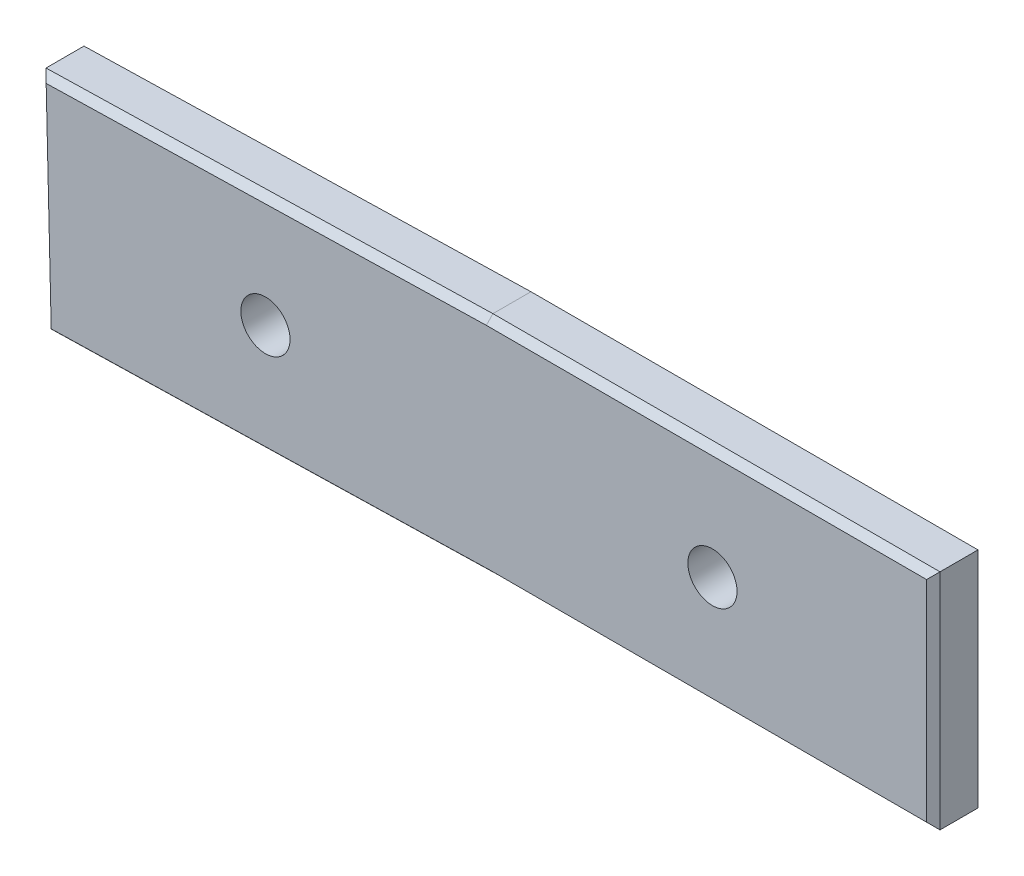
ISO-10303-21;
HEADER;
FILE_DESCRIPTION(('STEP AP214'),'2;1');
FILE_NAME('part.step','',(''),(''),'','','');
FILE_SCHEMA(('AUTOMOTIVE_DESIGN { 1 0 10303 214 1 1 1 1 }'));
ENDSEC;
DATA;
#1=APPLICATION_CONTEXT('core data for automotive mechanical design processes');
#2=APPLICATION_PROTOCOL_DEFINITION('international standard','automotive_design',2000,#1);
#3=PRODUCT_CONTEXT('',#1,'mechanical');
#4=PRODUCT('Part','Part','',(#3));
#5=PRODUCT_RELATED_PRODUCT_CATEGORY('part','',(#4));
#6=PRODUCT_DEFINITION_FORMATION('','',#4);
#7=PRODUCT_DEFINITION_CONTEXT('part definition',#1,'design');
#8=PRODUCT_DEFINITION('design','',#6,#7);
#9=PRODUCT_DEFINITION_SHAPE('','',#8);
#10=(LENGTH_UNIT() NAMED_UNIT(*) SI_UNIT(.MILLI.,.METRE.));
#11=(NAMED_UNIT(*) PLANE_ANGLE_UNIT() SI_UNIT($,.RADIAN.));
#12=(NAMED_UNIT(*) SI_UNIT($,.STERADIAN.) SOLID_ANGLE_UNIT());
#13=UNCERTAINTY_MEASURE_WITH_UNIT(LENGTH_MEASURE(1.E-05),#10,'distance_accuracy_value','');
#14=(GEOMETRIC_REPRESENTATION_CONTEXT(3) GLOBAL_UNCERTAINTY_ASSIGNED_CONTEXT((#13)) GLOBAL_UNIT_ASSIGNED_CONTEXT((#10,
#11,#12)) REPRESENTATION_CONTEXT('',''));
#15=CARTESIAN_POINT('',(0.,0.,0.));
#16=DIRECTION('',(0.,0.,1.));
#17=DIRECTION('',(1.,0.,0.));
#18=AXIS2_PLACEMENT_3D('',#15,#16,#17);
#19=CARTESIAN_POINT('',(0.,0.,4.));
#20=DIRECTION('',(0.,0.,-1.));
#21=DIRECTION('',(-1.,0.,0.));
#22=AXIS2_PLACEMENT_3D('',#19,#20,#21);
#23=PLANE('',#22);
#24=DIRECTION('',(-0.999711515104992,-0.0240184630332806,0.));
#25=VECTOR('',#24,1.);
#26=CARTESIAN_POINT('',(-0.754318254555894,31.3967069453414,4.));
#27=LINE('',#26,#25);
#28=CARTESIAN_POINT('',(-0.473188642169379,31.4034611950431,4.));
#29=VERTEX_POINT('',#28);
#30=CARTESIAN_POINT('',(-39.8545918779823,30.4573074661658,4.));
#31=VERTEX_POINT('',#30);
#32=EDGE_CURVE('E168',#29,#31,#27,.T.);
#33=ORIENTED_EDGE('',*,*,#32,.T.);
#34=DIRECTION('',(0.0240184630332843,-0.999711515104992,0.));
#35=VECTOR('',#34,1.);
#36=CARTESIAN_POINT('',(-39.1002736234263,-0.939399479175685,4.));
#37=LINE('',#36,#35);
#38=CARTESIAN_POINT('',(-39.4030414483786,11.6625926045236,4.));
#39=VERTEX_POINT('',#38);
#40=EDGE_CURVE('E170',#31,#39,#37,.T.);
#41=ORIENTED_EDGE('',*,*,#40,.T.);
#42=DIRECTION('',(0.999717030098688,0.0237878063440094,0.));
#43=VECTOR('',#42,1.);
#44=CARTESIAN_POINT('',(-0.299645585135955,12.5930399012913,4.));
#45=LINE('',#44,#43);
#46=CARTESIAN_POINT('',(-0.00713735173105463,12.6,4.));
#47=VERTEX_POINT('',#46);
#48=EDGE_CURVE('E120',#39,#47,#45,.T.);
#49=ORIENTED_EDGE('',*,*,#48,.T.);
#50=DIRECTION('',(1.,0.,0.));
#51=VECTOR('',#50,1.);
#52=CARTESIAN_POINT('',(0.,12.6,4.));
#53=LINE('',#52,#51);
#54=CARTESIAN_POINT('',(38.9196305895321,12.6,4.));
#55=VERTEX_POINT('',#54);
#56=EDGE_CURVE('E162',#47,#55,#53,.T.);
#57=ORIENTED_EDGE('',*,*,#56,.T.);
#58=DIRECTION('',(0.,1.,0.));
#59=VECTOR('',#58,1.);
#60=CARTESIAN_POINT('',(38.9196305895321,0.,4.));
#61=LINE('',#60,#59);
#62=CARTESIAN_POINT('',(38.9196305895321,31.4000519250343,4.));
#63=VERTEX_POINT('',#62);
#64=EDGE_CURVE('E164',#55,#63,#61,.T.);
#65=ORIENTED_EDGE('',*,*,#64,.T.);
#66=DIRECTION('',(-0.999999996254941,8.65454685021472E-05,0.));
#67=VECTOR('',#66,1.);
#68=CARTESIAN_POINT('',(0.00271782370729676,31.4034200074949,4.));
#69=LINE('',#68,#67);
#70=EDGE_CURVE('E166',#63,#29,#69,.T.);
#71=ORIENTED_EDGE('',*,*,#70,.T.);
#72=EDGE_LOOP('',(#33,#41,#49,#57,#65,#71));
#73=FACE_BOUND('',#72,.T.);
#74=CARTESIAN_POINT('',(19.759815294766,22.,4.));
#75=DIRECTION('',(0.,0.,1.));
#76=DIRECTION('',(1.,0.,0.));
#77=AXIS2_PLACEMENT_3D('',#74,#75,#76);
#78=CIRCLE('',#77,2.2);
#79=CARTESIAN_POINT('',(21.959815294766,22.,4.));
#80=VERTEX_POINT('',#79);
#81=EDGE_CURVE('E137',#80,#80,#78,.T.);
#82=ORIENTED_EDGE('',*,*,#81,.F.);
#83=EDGE_LOOP('',(#82));
#84=FACE_BOUND('',#83,.T.);
#85=CARTESIAN_POINT('',(-20.2344149324326,21.5259774070246,4.));
#86=DIRECTION('',(0.,0.,1.));
#87=DIRECTION('',(1.,0.,0.));
#88=AXIS2_PLACEMENT_3D('',#85,#86,#87);
#89=CIRCLE('',#88,2.2);
#90=CARTESIAN_POINT('',(-18.0344149324326,21.5259774070246,4.));
#91=VERTEX_POINT('',#90);
#92=EDGE_CURVE('E203',#91,#91,#89,.T.);
#93=ORIENTED_EDGE('',*,*,#92,.F.);
#94=EDGE_LOOP('',(#93));
#95=FACE_BOUND('',#94,.T.);
#96=ADVANCED_FACE('F41',(#73,#84,#95),#23,.F.);
#97=CARTESIAN_POINT('',(0.,0.,0.));
#98=DIRECTION('',(0.,0.,-1.));
#99=DIRECTION('',(-1.,0.,0.));
#100=AXIS2_PLACEMENT_3D('',#97,#98,#99);
#101=PLANE('',#100);
#102=CARTESIAN_POINT('',(19.759815294766,22.,0.));
#103=DIRECTION('',(0.,0.,1.));
#104=DIRECTION('',(1.,0.,0.));
#105=AXIS2_PLACEMENT_3D('',#102,#103,#104);
#106=CIRCLE('',#105,2.2);
#107=CARTESIAN_POINT('',(21.959815294766,22.,0.));
#108=VERTEX_POINT('',#107);
#109=EDGE_CURVE('E140',#108,#108,#106,.T.);
#110=ORIENTED_EDGE('',*,*,#109,.T.);
#111=EDGE_LOOP('',(#110));
#112=FACE_BOUND('',#111,.T.);
#113=DIRECTION('',(0.999717030098687,0.0237878063440094,0.));
#114=VECTOR('',#113,1.);
#115=CARTESIAN_POINT('',(0.,12.,0.));
#116=LINE('',#115,#114);
#117=CARTESIAN_POINT('',(-39.9884606041996,11.048492995309,0.));
#118=VERTEX_POINT('',#117);
#119=CARTESIAN_POINT('',(0.,12.,0.));
#120=VERTEX_POINT('',#119);
#121=EDGE_CURVE('E128',#118,#120,#116,.T.);
#122=ORIENTED_EDGE('',*,*,#121,.F.);
#123=DIRECTION('',(0.0240184630332843,-0.999711515104992,0.));
#124=VECTOR('',#123,1.);
#125=CARTESIAN_POINT('',(-39.9884606041996,11.048492995309,0.));
#126=LINE('',#125,#124);
#127=CARTESIAN_POINT('',(-40.4688298648653,31.0427232974089,0.));
#128=VERTEX_POINT('',#127);
#129=EDGE_CURVE('E151',#128,#118,#126,.T.);
#130=ORIENTED_EDGE('',*,*,#129,.F.);
#131=DIRECTION('',(-0.999711515104992,-0.0240184630332806,0.));
#132=VECTOR('',#131,1.);
#133=CARTESIAN_POINT('',(-40.4688298648653,31.0427232974089,0.));
#134=LINE('',#133,#132);
#135=CARTESIAN_POINT('',(-0.480369260665581,32.0034618187401,0.));
#136=VERTEX_POINT('',#135);
#137=EDGE_CURVE('E148',#136,#128,#134,.T.);
#138=ORIENTED_EDGE('',*,*,#137,.F.);
#139=DIRECTION('',(-0.999999996254941,8.65454685021472E-05,0.));
#140=VECTOR('',#139,1.);
#141=CARTESIAN_POINT('',(-0.480369260665581,32.0034618187401,0.));
#142=LINE('',#141,#140);
#143=CARTESIAN_POINT('',(39.5196305895321,32.,0.));
#144=VERTEX_POINT('',#143);
#145=EDGE_CURVE('E145',#144,#136,#142,.T.);
#146=ORIENTED_EDGE('',*,*,#145,.F.);
#147=DIRECTION('',(0.,1.,0.));
#148=VECTOR('',#147,1.);
#149=CARTESIAN_POINT('',(39.5196305895321,32.,0.));
#150=LINE('',#149,#148);
#151=CARTESIAN_POINT('',(39.5196305895321,12.,0.));
#152=VERTEX_POINT('',#151);
#153=EDGE_CURVE('E131',#152,#144,#150,.T.);
#154=ORIENTED_EDGE('',*,*,#153,.F.);
#155=DIRECTION('',(1.,0.,0.));
#156=VECTOR('',#155,1.);
#157=CARTESIAN_POINT('',(39.5196305895321,12.,0.));
#158=LINE('',#157,#156);
#159=EDGE_CURVE('E115',#120,#152,#158,.T.);
#160=ORIENTED_EDGE('',*,*,#159,.F.);
#161=EDGE_LOOP('',(#122,#130,#138,#146,#154,#160));
#162=FACE_BOUND('',#161,.T.);
#163=CARTESIAN_POINT('',(-20.2344149324326,21.5259774070246,0.));
#164=DIRECTION('',(0.,0.,1.));
#165=DIRECTION('',(1.,0.,0.));
#166=AXIS2_PLACEMENT_3D('',#163,#164,#165);
#167=CIRCLE('',#166,2.2);
#168=CARTESIAN_POINT('',(-18.0344149324326,21.5259774070246,0.));
#169=VERTEX_POINT('',#168);
#170=EDGE_CURVE('E197',#169,#169,#167,.T.);
#171=ORIENTED_EDGE('',*,*,#170,.T.);
#172=EDGE_LOOP('',(#171));
#173=FACE_BOUND('',#172,.T.);
#174=ADVANCED_FACE('F125',(#112,#162,#173),#101,.T.);
#175=CARTESIAN_POINT('',(0.,12.,4.));
#176=DIRECTION('',(-0.0237878063440094,0.999717030098687,0.));
#177=DIRECTION('',(-0.999717030098687,-0.0237878063440094,0.));
#178=AXIS2_PLACEMENT_3D('',#175,#176,#177);
#179=PLANE('',#178);
#180=DIRECTION('',(0.,0.,-1.));
#181=VECTOR('',#180,1.);
#182=CARTESIAN_POINT('',(0.,12.,4.));
#183=LINE('',#182,#181);
#184=CARTESIAN_POINT('',(0.,12.,3.4));
#185=VERTEX_POINT('',#184);
#186=EDGE_CURVE('E112',#185,#120,#183,.T.);
#187=ORIENTED_EDGE('',*,*,#186,.F.);
#188=DIRECTION('',(-0.999717030098687,-0.0237878063440094,0.));
#189=VECTOR('',#188,1.);
#190=CARTESIAN_POINT('',(0.,12.,3.4));
#191=LINE('',#190,#189);
#192=CARTESIAN_POINT('',(-39.9884606041996,11.048492995309,3.4));
#193=VERTEX_POINT('',#192);
#194=EDGE_CURVE('E11',#185,#193,#191,.T.);
#195=ORIENTED_EDGE('',*,*,#194,.T.);
#196=DIRECTION('',(0.,0.,-1.));
#197=VECTOR('',#196,1.);
#198=CARTESIAN_POINT('',(-39.9884606041996,11.048492995309,4.));
#199=LINE('',#198,#197);
#200=EDGE_CURVE('E135',#193,#118,#199,.T.);
#201=ORIENTED_EDGE('',*,*,#200,.T.);
#202=ORIENTED_EDGE('',*,*,#121,.T.);
#203=EDGE_LOOP('',(#187,#195,#201,#202));
#204=FACE_BOUND('',#203,.T.);
#205=ADVANCED_FACE('F133',(#204),#179,.F.);
#206=CARTESIAN_POINT('',(39.5196305895321,12.,4.));
#207=DIRECTION('',(0.,1.,0.));
#208=DIRECTION('',(0.,0.,1.));
#209=AXIS2_PLACEMENT_3D('',#206,#207,#208);
#210=PLANE('',#209);
#211=DIRECTION('',(0.,0.,-1.));
#212=VECTOR('',#211,1.);
#213=CARTESIAN_POINT('',(39.5196305895321,12.,4.));
#214=LINE('',#213,#212);
#215=CARTESIAN_POINT('',(39.5196305895321,12.,3.4));
#216=VERTEX_POINT('',#215);
#217=EDGE_CURVE('E121',#216,#152,#214,.T.);
#218=ORIENTED_EDGE('',*,*,#217,.F.);
#219=DIRECTION('',(-1.,0.,0.));
#220=VECTOR('',#219,1.);
#221=CARTESIAN_POINT('',(39.5196305895321,12.,3.4));
#222=LINE('',#221,#220);
#223=EDGE_CURVE('E51',#216,#185,#222,.T.);
#224=ORIENTED_EDGE('',*,*,#223,.T.);
#225=ORIENTED_EDGE('',*,*,#186,.T.);
#226=ORIENTED_EDGE('',*,*,#159,.T.);
#227=EDGE_LOOP('',(#218,#224,#225,#226));
#228=FACE_BOUND('',#227,.T.);
#229=ADVANCED_FACE('F114',(#228),#210,.F.);
#230=CARTESIAN_POINT('',(39.5196305895321,32.,4.));
#231=DIRECTION('',(-1.,0.,0.));
#232=DIRECTION('',(0.,0.,1.));
#233=AXIS2_PLACEMENT_3D('',#230,#231,#232);
#234=PLANE('',#233);
#235=DIRECTION('',(0.,0.,-1.));
#236=VECTOR('',#235,1.);
#237=CARTESIAN_POINT('',(39.5196305895321,32.,4.));
#238=LINE('',#237,#236);
#239=CARTESIAN_POINT('',(39.5196305895321,32.,3.4));
#240=VERTEX_POINT('',#239);
#241=EDGE_CURVE('E158',#240,#144,#238,.T.);
#242=ORIENTED_EDGE('',*,*,#241,.F.);
#243=DIRECTION('',(0.,-1.,0.));
#244=VECTOR('',#243,1.);
#245=CARTESIAN_POINT('',(39.5196305895321,32.,3.4));
#246=LINE('',#245,#244);
#247=EDGE_CURVE('E66',#240,#216,#246,.T.);
#248=ORIENTED_EDGE('',*,*,#247,.T.);
#249=ORIENTED_EDGE('',*,*,#217,.T.);
#250=ORIENTED_EDGE('',*,*,#153,.T.);
#251=EDGE_LOOP('',(#242,#248,#249,#250));
#252=FACE_BOUND('',#251,.T.);
#253=ADVANCED_FACE('F244',(#252),#234,.F.);
#254=CARTESIAN_POINT('',(-0.480369260665581,32.0034618187401,4.));
#255=DIRECTION('',(-8.65454685021472E-05,-0.999999996254941,0.));
#256=DIRECTION('',(0.999999996254941,-8.65454685021472E-05,0.));
#257=AXIS2_PLACEMENT_3D('',#254,#255,#256);
#258=PLANE('',#257);
#259=DIRECTION('',(0.,0.,-1.));
#260=VECTOR('',#259,1.);
#261=CARTESIAN_POINT('',(-0.480369260665581,32.0034618187401,4.));
#262=LINE('',#261,#260);
#263=CARTESIAN_POINT('',(-0.480369260665581,32.0034618187401,3.4));
#264=VERTEX_POINT('',#263);
#265=EDGE_CURVE('E156',#264,#136,#262,.T.);
#266=ORIENTED_EDGE('',*,*,#265,.F.);
#267=DIRECTION('',(0.999999996254941,-8.65454685021472E-05,0.));
#268=VECTOR('',#267,1.);
#269=CARTESIAN_POINT('',(-0.480369260665581,32.0034618187401,3.4));
#270=LINE('',#269,#268);
#271=EDGE_CURVE('E178',#264,#240,#270,.T.);
#272=ORIENTED_EDGE('',*,*,#271,.T.);
#273=ORIENTED_EDGE('',*,*,#241,.T.);
#274=ORIENTED_EDGE('',*,*,#145,.T.);
#275=EDGE_LOOP('',(#266,#272,#273,#274));
#276=FACE_BOUND('',#275,.T.);
#277=ADVANCED_FACE('F240',(#276),#258,.F.);
#278=CARTESIAN_POINT('',(-40.4688298648653,31.0427232974089,4.));
#279=DIRECTION('',(0.0240184630332806,-0.999711515104992,0.));
#280=DIRECTION('',(0.999711515104992,0.0240184630332806,0.));
#281=AXIS2_PLACEMENT_3D('',#278,#279,#280);
#282=PLANE('',#281);
#283=DIRECTION('',(0.,0.,-1.));
#284=VECTOR('',#283,1.);
#285=CARTESIAN_POINT('',(-40.4688298648653,31.0427232974089,4.));
#286=LINE('',#285,#284);
#287=CARTESIAN_POINT('',(-40.4688298648653,31.0427232974089,3.4));
#288=VERTEX_POINT('',#287);
#289=EDGE_CURVE('E154',#288,#128,#286,.T.);
#290=ORIENTED_EDGE('',*,*,#289,.F.);
#291=DIRECTION('',(0.999711515104992,0.0240184630332806,0.));
#292=VECTOR('',#291,1.);
#293=CARTESIAN_POINT('',(-40.4688298648653,31.0427232974089,3.4));
#294=LINE('',#293,#292);
#295=EDGE_CURVE('E176',#288,#264,#294,.T.);
#296=ORIENTED_EDGE('',*,*,#295,.T.);
#297=ORIENTED_EDGE('',*,*,#265,.T.);
#298=ORIENTED_EDGE('',*,*,#137,.T.);
#299=EDGE_LOOP('',(#290,#296,#297,#298));
#300=FACE_BOUND('',#299,.T.);
#301=ADVANCED_FACE('F226',(#300),#282,.F.);
#302=CARTESIAN_POINT('',(-39.9884606041996,11.048492995309,4.));
#303=DIRECTION('',(0.999711515104992,0.0240184630332843,0.));
#304=DIRECTION('',(-0.0240184630332843,0.999711515104992,0.));
#305=AXIS2_PLACEMENT_3D('',#302,#303,#304);
#306=PLANE('',#305);
#307=ORIENTED_EDGE('',*,*,#200,.F.);
#308=DIRECTION('',(-0.0240184630332843,0.999711515104992,0.));
#309=VECTOR('',#308,1.);
#310=CARTESIAN_POINT('',(-39.9884606041996,11.048492995309,3.4));
#311=LINE('',#310,#309);
#312=EDGE_CURVE('E173',#193,#288,#311,.T.);
#313=ORIENTED_EDGE('',*,*,#312,.T.);
#314=ORIENTED_EDGE('',*,*,#289,.T.);
#315=ORIENTED_EDGE('',*,*,#129,.T.);
#316=EDGE_LOOP('',(#307,#313,#314,#315));
#317=FACE_BOUND('',#316,.T.);
#318=ADVANCED_FACE('F217',(#317),#306,.F.);
#319=CARTESIAN_POINT('',(19.759815294766,22.,4.));
#320=DIRECTION('',(0.,0.,-1.));
#321=DIRECTION('',(-1.,0.,0.));
#322=AXIS2_PLACEMENT_3D('',#319,#320,#321);
#323=CYLINDRICAL_SURFACE('',#322,2.2);
#324=ORIENTED_EDGE('',*,*,#81,.T.);
#325=EDGE_LOOP('',(#324));
#326=FACE_BOUND('',#325,.T.);
#327=ORIENTED_EDGE('',*,*,#109,.F.);
#328=EDGE_LOOP('',(#327));
#329=FACE_BOUND('',#328,.T.);
#330=ADVANCED_FACE('F214',(#326,#329),#323,.F.);
#331=CARTESIAN_POINT('',(-20.2344149324326,21.5259774070246,4.));
#332=DIRECTION('',(0.,0.,-1.));
#333=DIRECTION('',(-1.,0.,0.));
#334=AXIS2_PLACEMENT_3D('',#331,#332,#333);
#335=CYLINDRICAL_SURFACE('',#334,2.2);
#336=ORIENTED_EDGE('',*,*,#92,.T.);
#337=EDGE_LOOP('',(#336));
#338=FACE_BOUND('',#337,.T.);
#339=ORIENTED_EDGE('',*,*,#170,.F.);
#340=EDGE_LOOP('',(#339));
#341=FACE_BOUND('',#340,.T.);
#342=ADVANCED_FACE('F216',(#338,#341),#335,.F.);
#343=CARTESIAN_POINT('',(38.9196305895321,0.,4.));
#344=DIRECTION('',(-0.707106781186552,0.,-0.707106781186543));
#345=DIRECTION('',(0.,1.,0.));
#346=AXIS2_PLACEMENT_3D('',#343,#344,#345);
#347=PLANE('',#346);
#348=DIRECTION('',(-0.577350269189622,0.577350269189626,0.577350269189629));
#349=VECTOR('',#348,1.);
#350=CARTESIAN_POINT('',(25.9464203930215,25.5732101965106,16.9732101965107));
#351=LINE('',#350,#349);
#352=EDGE_CURVE('E191',#216,#55,#351,.T.);
#353=ORIENTED_EDGE('',*,*,#352,.F.);
#354=ORIENTED_EDGE('',*,*,#247,.F.);
#355=DIRECTION('',(-0.5773669241521,-0.577316957823238,0.577366924152107));
#356=VECTOR('',#355,1.);
#357=CARTESIAN_POINT('',(28.4532485930302,20.934575707272,14.466381996502));
#358=LINE('',#357,#356);
#359=EDGE_CURVE('E46',#63,#240,#358,.F.);
#360=ORIENTED_EDGE('',*,*,#359,.F.);
#361=ORIENTED_EDGE('',*,*,#64,.F.);
#362=EDGE_LOOP('',(#353,#354,#360,#361));
#363=FACE_BOUND('',#362,.T.);
#364=ADVANCED_FACE('F44',(#363),#347,.F.);
#365=CARTESIAN_POINT('',(0.00271782370729675,31.4034200074949,4.));
#366=DIRECTION('',(-6.11968876588354E-05,-0.707106778538395,-0.707106781186544));
#367=DIRECTION('',(-0.999999996254941,8.65454685021472E-05,0.));
#368=AXIS2_PLACEMENT_3D('',#365,#366,#367);
#369=PLANE('',#368);
#370=ORIENTED_EDGE('',*,*,#359,.T.);
#371=ORIENTED_EDGE('',*,*,#271,.F.);
#372=DIRECTION('',(0.00846213266147986,-0.707081831095554,0.707081096088262));
#373=VECTOR('',#372,1.);
#374=CARTESIAN_POINT('',(-0.473154317164683,31.4005930543337,4.0028681377279));
#375=LINE('',#374,#373);
#376=EDGE_CURVE('E189',#29,#264,#375,.F.);
#377=ORIENTED_EDGE('',*,*,#376,.F.);
#378=ORIENTED_EDGE('',*,*,#70,.F.);
#379=EDGE_LOOP('',(#370,#371,#377,#378));
#380=FACE_BOUND('',#379,.T.);
#381=ADVANCED_FACE('F278',(#380),#369,.F.);
#382=CARTESIAN_POINT('',(0.,12.6,4.));
#383=DIRECTION('',(0.,0.70710678118655,-0.707106781186546));
#384=DIRECTION('',(1.,0.,0.));
#385=AXIS2_PLACEMENT_3D('',#382,#383,#384);
#386=PLANE('',#385);
#387=ORIENTED_EDGE('',*,*,#352,.T.);
#388=ORIENTED_EDGE('',*,*,#56,.F.);
#389=DIRECTION('',(-0.00841115213156688,0.707081767732634,0.707081767732638));
#390=VECTOR('',#389,1.);
#391=CARTESIAN_POINT('',(-0.00713684678143059,12.5999575515119,3.99995755151189));
#392=LINE('',#391,#390);
#393=EDGE_CURVE('E186',#185,#47,#392,.T.);
#394=ORIENTED_EDGE('',*,*,#393,.F.);
#395=ORIENTED_EDGE('',*,*,#223,.F.);
#396=EDGE_LOOP('',(#387,#388,#394,#395));
#397=FACE_BOUND('',#396,.T.);
#398=ADVANCED_FACE('F272',(#397),#386,.F.);
#399=CARTESIAN_POINT('',(-0.754318254555894,31.3967069453414,4.));
#400=DIRECTION('',(0.0169836180845111,-0.706902791561019,-0.707106781186547));
#401=DIRECTION('',(-0.999711515104992,-0.0240184630332806,0.));
#402=AXIS2_PLACEMENT_3D('',#399,#400,#401);
#403=PLANE('',#402);
#404=ORIENTED_EDGE('',*,*,#376,.T.);
#405=ORIENTED_EDGE('',*,*,#295,.F.);
#406=DIRECTION('',(0.591050778455609,-0.563316646260056,0.577350269189633));
#407=VECTOR('',#406,1.);
#408=CARTESIAN_POINT('',(-26.5080341771156,17.737016084749,17.037185572253));
#409=LINE('',#408,#407);
#410=EDGE_CURVE('E184',#31,#288,#409,.F.);
#411=ORIENTED_EDGE('',*,*,#410,.F.);
#412=ORIENTED_EDGE('',*,*,#32,.F.);
#413=EDGE_LOOP('',(#404,#405,#411,#412));
#414=FACE_BOUND('',#413,.T.);
#415=ADVANCED_FACE('F265',(#414),#403,.F.);
#416=CARTESIAN_POINT('',(-0.299645585135955,12.5930399012913,4.));
#417=DIRECTION('',(-0.0168205191754014,0.706906691250459,-0.707106781186546));
#418=DIRECTION('',(0.999717030098687,0.0237878063440094,0.));
#419=AXIS2_PLACEMENT_3D('',#416,#417,#418);
#420=PLANE('',#419);
#421=ORIENTED_EDGE('',*,*,#393,.T.);
#422=ORIENTED_EDGE('',*,*,#48,.F.);
#423=DIRECTION('',(-0.563363163881146,-0.590963065258949,-0.577394666654943));
#424=VECTOR('',#423,1.);
#425=CARTESIAN_POINT('',(-26.682710886439,25.0061088688863,17.0371516908431));
#426=LINE('',#425,#424);
#427=EDGE_CURVE('E182',#193,#39,#426,.F.);
#428=ORIENTED_EDGE('',*,*,#427,.F.);
#429=ORIENTED_EDGE('',*,*,#194,.F.);
#430=EDGE_LOOP('',(#421,#422,#428,#429));
#431=FACE_BOUND('',#430,.T.);
#432=ADVANCED_FACE('F258',(#431),#420,.F.);
#433=CARTESIAN_POINT('',(-39.1002736234263,-0.939399479175685,4.));
#434=DIRECTION('',(0.706902791561031,0.016983618084514,-0.707106781186534));
#435=DIRECTION('',(0.0240184630332843,-0.999711515104992,0.));
#436=AXIS2_PLACEMENT_3D('',#433,#434,#435);
#437=PLANE('',#436);
#438=ORIENTED_EDGE('',*,*,#410,.T.);
#439=ORIENTED_EDGE('',*,*,#312,.F.);
#440=ORIENTED_EDGE('',*,*,#427,.T.);
#441=ORIENTED_EDGE('',*,*,#40,.F.);
#442=EDGE_LOOP('',(#438,#439,#440,#441));
#443=FACE_BOUND('',#442,.T.);
#444=ADVANCED_FACE('F252',(#443),#437,.F.);
#445=CLOSED_SHELL('',(#96,#174,#205,#229,#253,#277,#301,#318,#330,#342,#364,#381,#398,#415,#432,#444));
#446=MANIFOLD_SOLID_BREP('B2',#445);
#447=ADVANCED_BREP_SHAPE_REPRESENTATION('',(#18,#446),#14);
#448=SHAPE_DEFINITION_REPRESENTATION(#9,#447);
ENDSEC;
END-ISO-10303-21;
